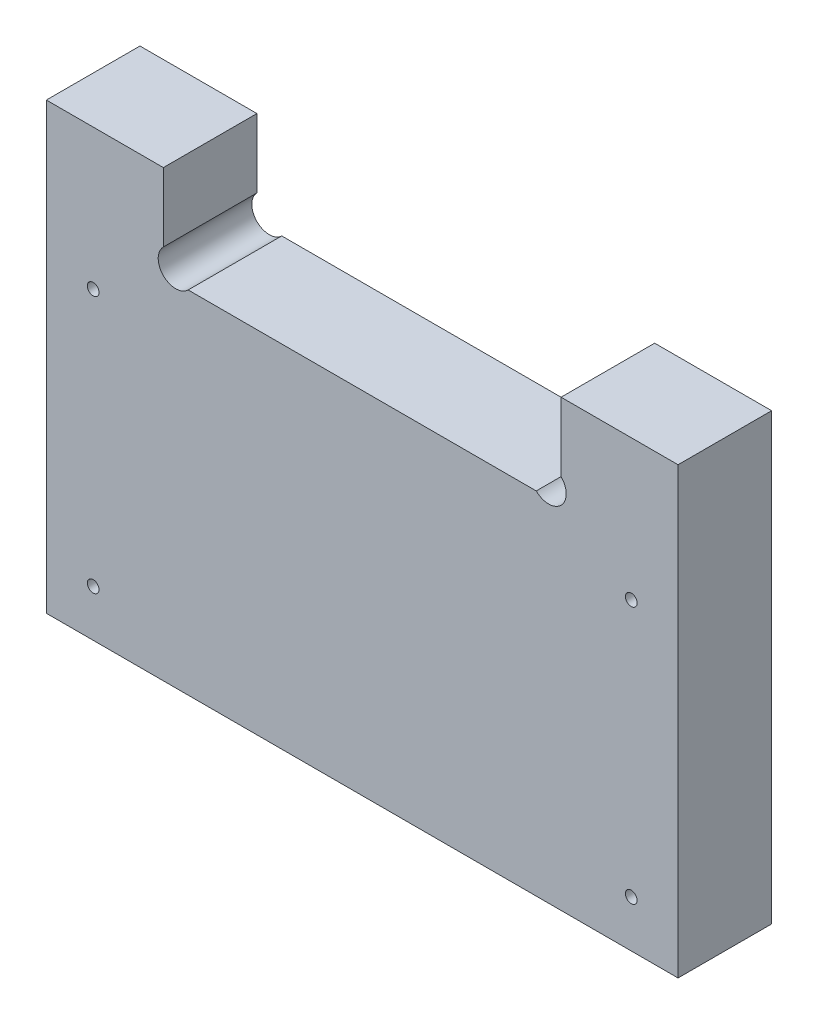
ISO-10303-21;
HEADER;
FILE_DESCRIPTION(('STEP AP214'),'2;1');
FILE_NAME('part.step','',(''),(''),'','','');
FILE_SCHEMA(('AUTOMOTIVE_DESIGN { 1 0 10303 214 1 1 1 1 }'));
ENDSEC;
DATA;
#1=APPLICATION_CONTEXT('core data for automotive mechanical design processes');
#2=APPLICATION_PROTOCOL_DEFINITION('international standard','automotive_design',2000,#1);
#3=PRODUCT_CONTEXT('',#1,'mechanical');
#4=PRODUCT('Part','Part','',(#3));
#5=PRODUCT_RELATED_PRODUCT_CATEGORY('part','',(#4));
#6=PRODUCT_DEFINITION_FORMATION('','',#4);
#7=PRODUCT_DEFINITION_CONTEXT('part definition',#1,'design');
#8=PRODUCT_DEFINITION('design','',#6,#7);
#9=PRODUCT_DEFINITION_SHAPE('','',#8);
#10=(LENGTH_UNIT() NAMED_UNIT(*) SI_UNIT(.MILLI.,.METRE.));
#11=(NAMED_UNIT(*) PLANE_ANGLE_UNIT() SI_UNIT($,.RADIAN.));
#12=(NAMED_UNIT(*) SI_UNIT($,.STERADIAN.) SOLID_ANGLE_UNIT());
#13=UNCERTAINTY_MEASURE_WITH_UNIT(LENGTH_MEASURE(1.E-05),#10,'distance_accuracy_value','');
#14=(GEOMETRIC_REPRESENTATION_CONTEXT(3) GLOBAL_UNCERTAINTY_ASSIGNED_CONTEXT((#13)) GLOBAL_UNIT_ASSIGNED_CONTEXT((#10,
#11,#12)) REPRESENTATION_CONTEXT('',''));
#15=CARTESIAN_POINT('',(0.,0.,0.));
#16=DIRECTION('',(0.,0.,1.));
#17=DIRECTION('',(1.,0.,0.));
#18=AXIS2_PLACEMENT_3D('',#15,#16,#17);
#19=CARTESIAN_POINT('',(-114.826935211401,-44.3478207107489,8.));
#20=DIRECTION('',(0.,1.,0.));
#21=DIRECTION('',(0.,0.,1.));
#22=AXIS2_PLACEMENT_3D('',#19,#20,#21);
#23=PLANE('',#22);
#24=DIRECTION('',(1.,0.,0.));
#25=VECTOR('',#24,1.);
#26=CARTESIAN_POINT('',(-114.826935211401,-44.3478207107489,0.));
#27=LINE('',#26,#25);
#28=CARTESIAN_POINT('',(-114.826935211401,-44.3478207107489,0.));
#29=VERTEX_POINT('',#28);
#30=CARTESIAN_POINT('',(-60.8269352114008,-44.3478207107489,0.));
#31=VERTEX_POINT('',#30);
#32=EDGE_CURVE('E140',#29,#31,#27,.T.);
#33=ORIENTED_EDGE('',*,*,#32,.T.);
#34=DIRECTION('',(0.,0.,-1.));
#35=VECTOR('',#34,1.);
#36=CARTESIAN_POINT('',(-60.8269352114008,-44.3478207107489,8.));
#37=LINE('',#36,#35);
#38=CARTESIAN_POINT('',(-60.8269352114008,-44.3478207107489,8.));
#39=VERTEX_POINT('',#38);
#40=EDGE_CURVE('E11',#39,#31,#37,.T.);
#41=ORIENTED_EDGE('',*,*,#40,.F.);
#42=DIRECTION('',(1.,0.,0.));
#43=VECTOR('',#42,1.);
#44=CARTESIAN_POINT('',(-114.826935211401,-44.3478207107489,8.));
#45=LINE('',#44,#43);
#46=CARTESIAN_POINT('',(-114.826935211401,-44.3478207107489,8.));
#47=VERTEX_POINT('',#46);
#48=EDGE_CURVE('E159',#47,#39,#45,.T.);
#49=ORIENTED_EDGE('',*,*,#48,.F.);
#50=DIRECTION('',(0.,0.,-1.));
#51=VECTOR('',#50,1.);
#52=CARTESIAN_POINT('',(-114.826935211401,-44.3478207107489,8.));
#53=LINE('',#52,#51);
#54=EDGE_CURVE('E136',#47,#29,#53,.T.);
#55=ORIENTED_EDGE('',*,*,#54,.T.);
#56=EDGE_LOOP('',(#33,#41,#49,#55));
#57=FACE_BOUND('',#56,.T.);
#58=ADVANCED_FACE('F32',(#57),#23,.F.);
#59=CARTESIAN_POINT('',(-60.8269352114008,-6.34782071074889,8.));
#60=DIRECTION('',(-1.,0.,0.));
#61=DIRECTION('',(0.,-1.,0.));
#62=AXIS2_PLACEMENT_3D('',#59,#60,#61);
#63=PLANE('',#62);
#64=DIRECTION('',(0.,1.,0.));
#65=VECTOR('',#64,1.);
#66=CARTESIAN_POINT('',(-60.8269352114008,-6.34782071074889,0.));
#67=LINE('',#66,#65);
#68=CARTESIAN_POINT('',(-60.8269352114008,-6.34782071074889,0.));
#69=VERTEX_POINT('',#68);
#70=EDGE_CURVE('E143',#31,#69,#67,.T.);
#71=ORIENTED_EDGE('',*,*,#70,.T.);
#72=DIRECTION('',(0.,0.,-1.));
#73=VECTOR('',#72,1.);
#74=CARTESIAN_POINT('',(-60.8269352114008,-6.34782071074889,8.));
#75=LINE('',#74,#73);
#76=CARTESIAN_POINT('',(-60.8269352114008,-6.34782071074889,8.));
#77=VERTEX_POINT('',#76);
#78=EDGE_CURVE('E40',#77,#69,#75,.T.);
#79=ORIENTED_EDGE('',*,*,#78,.F.);
#80=DIRECTION('',(0.,1.,0.));
#81=VECTOR('',#80,1.);
#82=CARTESIAN_POINT('',(-60.8269352114008,-6.34782071074889,8.));
#83=LINE('',#82,#81);
#84=EDGE_CURVE('E97',#39,#77,#83,.T.);
#85=ORIENTED_EDGE('',*,*,#84,.F.);
#86=ORIENTED_EDGE('',*,*,#40,.T.);
#87=EDGE_LOOP('',(#71,#79,#85,#86));
#88=FACE_BOUND('',#87,.T.);
#89=ADVANCED_FACE('F263',(#88),#63,.F.);
#90=CARTESIAN_POINT('',(-60.8269352114008,-6.34782071074889,8.));
#91=DIRECTION('',(0.,-1.,0.));
#92=DIRECTION('',(1.,0.,0.));
#93=AXIS2_PLACEMENT_3D('',#90,#91,#92);
#94=PLANE('',#93);
#95=DIRECTION('',(-1.,0.,0.));
#96=VECTOR('',#95,1.);
#97=CARTESIAN_POINT('',(-60.8269352114008,-6.34782071074889,0.));
#98=LINE('',#97,#96);
#99=CARTESIAN_POINT('',(-70.8269352114008,-6.34782071074889,0.));
#100=VERTEX_POINT('',#99);
#101=EDGE_CURVE('E146',#69,#100,#98,.T.);
#102=ORIENTED_EDGE('',*,*,#101,.T.);
#103=DIRECTION('',(0.,0.,-1.));
#104=VECTOR('',#103,1.);
#105=CARTESIAN_POINT('',(-70.8269352114008,-6.34782071074889,8.));
#106=LINE('',#105,#104);
#107=CARTESIAN_POINT('',(-70.8269352114008,-6.34782071074889,8.));
#108=VERTEX_POINT('',#107);
#109=EDGE_CURVE('E172',#108,#100,#106,.T.);
#110=ORIENTED_EDGE('',*,*,#109,.F.);
#111=DIRECTION('',(-1.,0.,0.));
#112=VECTOR('',#111,1.);
#113=CARTESIAN_POINT('',(-60.8269352114008,-6.34782071074889,8.));
#114=LINE('',#113,#112);
#115=EDGE_CURVE('E180',#77,#108,#114,.T.);
#116=ORIENTED_EDGE('',*,*,#115,.F.);
#117=ORIENTED_EDGE('',*,*,#78,.T.);
#118=EDGE_LOOP('',(#102,#110,#116,#117));
#119=FACE_BOUND('',#118,.T.);
#120=ADVANCED_FACE('F178',(#119),#94,.F.);
#121=CARTESIAN_POINT('',(-70.8269352114008,-6.34782071074889,8.));
#122=DIRECTION('',(1.,0.,0.));
#123=DIRECTION('',(0.,0.,-1.));
#124=AXIS2_PLACEMENT_3D('',#121,#122,#123);
#125=PLANE('',#124);
#126=DIRECTION('',(0.,-1.,0.));
#127=VECTOR('',#126,1.);
#128=CARTESIAN_POINT('',(-70.8269352114008,-6.34782071074889,0.));
#129=LINE('',#128,#127);
#130=CARTESIAN_POINT('',(-70.8269352114008,-12.2265003671892,0.));
#131=VERTEX_POINT('',#130);
#132=EDGE_CURVE('E148',#100,#131,#129,.T.);
#133=ORIENTED_EDGE('',*,*,#132,.T.);
#134=DIRECTION('',(0.,0.,-1.));
#135=VECTOR('',#134,1.);
#136=CARTESIAN_POINT('',(-70.8269352114008,-12.2265003671892,8.));
#137=LINE('',#136,#135);
#138=CARTESIAN_POINT('',(-70.8269352114008,-12.2265003671892,8.));
#139=VERTEX_POINT('',#138);
#140=EDGE_CURVE('E169',#139,#131,#137,.T.);
#141=ORIENTED_EDGE('',*,*,#140,.F.);
#142=DIRECTION('',(0.,-1.,0.));
#143=VECTOR('',#142,1.);
#144=CARTESIAN_POINT('',(-70.8269352114008,-6.34782071074889,8.));
#145=LINE('',#144,#143);
#146=EDGE_CURVE('E198',#108,#139,#145,.T.);
#147=ORIENTED_EDGE('',*,*,#146,.F.);
#148=ORIENTED_EDGE('',*,*,#109,.T.);
#149=EDGE_LOOP('',(#133,#141,#147,#148));
#150=FACE_BOUND('',#149,.T.);
#151=ADVANCED_FACE('F189',(#150),#125,.F.);
#152=CARTESIAN_POINT('',(-71.8875953831806,-13.2871605389691,8.));
#153=DIRECTION('',(0.,0.,-1.));
#154=DIRECTION('',(-1.,0.,0.));
#155=AXIS2_PLACEMENT_3D('',#152,#153,#154);
#156=CYLINDRICAL_SURFACE('',#155,1.5);
#157=CARTESIAN_POINT('',(-71.8875953831806,-13.2871605389691,0.));
#158=DIRECTION('',(0.,0.,-1.));
#159=DIRECTION('',(1.,0.,0.));
#160=AXIS2_PLACEMENT_3D('',#157,#158,#159);
#161=CIRCLE('',#160,1.5);
#162=CARTESIAN_POINT('',(-72.9482555549604,-14.3478207107489,0.));
#163=VERTEX_POINT('',#162);
#164=EDGE_CURVE('E150',#131,#163,#161,.T.);
#165=ORIENTED_EDGE('',*,*,#164,.T.);
#166=DIRECTION('',(0.,0.,-1.));
#167=VECTOR('',#166,1.);
#168=CARTESIAN_POINT('',(-72.9482555549604,-14.3478207107489,8.));
#169=LINE('',#168,#167);
#170=CARTESIAN_POINT('',(-72.9482555549604,-14.3478207107489,8.));
#171=VERTEX_POINT('',#170);
#172=EDGE_CURVE('E166',#171,#163,#169,.T.);
#173=ORIENTED_EDGE('',*,*,#172,.F.);
#174=CARTESIAN_POINT('',(-71.8875953831806,-13.2871605389691,8.));
#175=DIRECTION('',(0.,0.,-1.));
#176=DIRECTION('',(1.,0.,0.));
#177=AXIS2_PLACEMENT_3D('',#174,#175,#176);
#178=CIRCLE('',#177,1.5);
#179=EDGE_CURVE('E195',#139,#171,#178,.T.);
#180=ORIENTED_EDGE('',*,*,#179,.F.);
#181=ORIENTED_EDGE('',*,*,#140,.T.);
#182=EDGE_LOOP('',(#165,#173,#180,#181));
#183=FACE_BOUND('',#182,.T.);
#184=ADVANCED_FACE('F193',(#183),#156,.F.);
#185=CARTESIAN_POINT('',(-102.705614867841,-14.3478207107489,8.));
#186=DIRECTION('',(0.,-1.,0.));
#187=DIRECTION('',(0.,0.,-1.));
#188=AXIS2_PLACEMENT_3D('',#185,#186,#187);
#189=PLANE('',#188);
#190=DIRECTION('',(-1.,0.,0.));
#191=VECTOR('',#190,1.);
#192=CARTESIAN_POINT('',(-102.705614867841,-14.3478207107489,0.));
#193=LINE('',#192,#191);
#194=CARTESIAN_POINT('',(-102.705614867841,-14.3478207107489,0.));
#195=VERTEX_POINT('',#194);
#196=EDGE_CURVE('E152',#163,#195,#193,.T.);
#197=ORIENTED_EDGE('',*,*,#196,.T.);
#198=DIRECTION('',(0.,0.,-1.));
#199=VECTOR('',#198,1.);
#200=CARTESIAN_POINT('',(-102.705614867841,-14.3478207107489,8.));
#201=LINE('',#200,#199);
#202=CARTESIAN_POINT('',(-102.705614867841,-14.3478207107489,8.));
#203=VERTEX_POINT('',#202);
#204=EDGE_CURVE('E163',#203,#195,#201,.T.);
#205=ORIENTED_EDGE('',*,*,#204,.F.);
#206=DIRECTION('',(-1.,0.,0.));
#207=VECTOR('',#206,1.);
#208=CARTESIAN_POINT('',(-102.705614867841,-14.3478207107489,8.));
#209=LINE('',#208,#207);
#210=EDGE_CURVE('E197',#171,#203,#209,.T.);
#211=ORIENTED_EDGE('',*,*,#210,.F.);
#212=ORIENTED_EDGE('',*,*,#172,.T.);
#213=EDGE_LOOP('',(#197,#205,#211,#212));
#214=FACE_BOUND('',#213,.T.);
#215=ADVANCED_FACE('F275',(#214),#189,.F.);
#216=CARTESIAN_POINT('',(-103.766275039621,-13.2871605389691,8.));
#217=DIRECTION('',(0.,0.,-1.));
#218=DIRECTION('',(-1.,0.,0.));
#219=AXIS2_PLACEMENT_3D('',#216,#217,#218);
#220=CYLINDRICAL_SURFACE('',#219,1.5);
#221=CARTESIAN_POINT('',(-103.766275039621,-13.2871605389691,0.));
#222=DIRECTION('',(0.,0.,-1.));
#223=DIRECTION('',(1.,0.,0.));
#224=AXIS2_PLACEMENT_3D('',#221,#222,#223);
#225=CIRCLE('',#224,1.5);
#226=CARTESIAN_POINT('',(-104.826935211401,-12.2265003671892,0.));
#227=VERTEX_POINT('',#226);
#228=EDGE_CURVE('E154',#195,#227,#225,.T.);
#229=ORIENTED_EDGE('',*,*,#228,.T.);
#230=DIRECTION('',(0.,0.,-1.));
#231=VECTOR('',#230,1.);
#232=CARTESIAN_POINT('',(-104.826935211401,-12.2265003671892,8.));
#233=LINE('',#232,#231);
#234=CARTESIAN_POINT('',(-104.826935211401,-12.2265003671892,8.));
#235=VERTEX_POINT('',#234);
#236=EDGE_CURVE('E131',#235,#227,#233,.T.);
#237=ORIENTED_EDGE('',*,*,#236,.F.);
#238=CARTESIAN_POINT('',(-103.766275039621,-13.2871605389691,8.));
#239=DIRECTION('',(0.,0.,-1.));
#240=DIRECTION('',(1.,0.,0.));
#241=AXIS2_PLACEMENT_3D('',#238,#239,#240);
#242=CIRCLE('',#241,1.5);
#243=EDGE_CURVE('E122',#203,#235,#242,.T.);
#244=ORIENTED_EDGE('',*,*,#243,.F.);
#245=ORIENTED_EDGE('',*,*,#204,.T.);
#246=EDGE_LOOP('',(#229,#237,#244,#245));
#247=FACE_BOUND('',#246,.T.);
#248=ADVANCED_FACE('F272',(#247),#220,.F.);
#249=CARTESIAN_POINT('',(-104.826935211401,-6.34782071074889,8.));
#250=DIRECTION('',(-1.,0.,0.));
#251=DIRECTION('',(0.,0.,1.));
#252=AXIS2_PLACEMENT_3D('',#249,#250,#251);
#253=PLANE('',#252);
#254=DIRECTION('',(0.,1.,0.));
#255=VECTOR('',#254,1.);
#256=CARTESIAN_POINT('',(-104.826935211401,-6.34782071074889,0.));
#257=LINE('',#256,#255);
#258=CARTESIAN_POINT('',(-104.826935211401,-6.34782071074889,0.));
#259=VERTEX_POINT('',#258);
#260=EDGE_CURVE('E130',#227,#259,#257,.T.);
#261=ORIENTED_EDGE('',*,*,#260,.T.);
#262=DIRECTION('',(0.,0.,-1.));
#263=VECTOR('',#262,1.);
#264=CARTESIAN_POINT('',(-104.826935211401,-6.34782071074889,8.));
#265=LINE('',#264,#263);
#266=CARTESIAN_POINT('',(-104.826935211401,-6.34782071074889,8.));
#267=VERTEX_POINT('',#266);
#268=EDGE_CURVE('E127',#267,#259,#265,.T.);
#269=ORIENTED_EDGE('',*,*,#268,.F.);
#270=DIRECTION('',(0.,1.,0.));
#271=VECTOR('',#270,1.);
#272=CARTESIAN_POINT('',(-104.826935211401,-6.34782071074889,8.));
#273=LINE('',#272,#271);
#274=EDGE_CURVE('E116',#235,#267,#273,.T.);
#275=ORIENTED_EDGE('',*,*,#274,.F.);
#276=ORIENTED_EDGE('',*,*,#236,.T.);
#277=EDGE_LOOP('',(#261,#269,#275,#276));
#278=FACE_BOUND('',#277,.T.);
#279=ADVANCED_FACE('F128',(#278),#253,.F.);
#280=CARTESIAN_POINT('',(-114.826935211401,-6.34782071074889,8.));
#281=DIRECTION('',(0.,-1.,0.));
#282=DIRECTION('',(0.,0.,-1.));
#283=AXIS2_PLACEMENT_3D('',#280,#281,#282);
#284=PLANE('',#283);
#285=DIRECTION('',(-1.,0.,0.));
#286=VECTOR('',#285,1.);
#287=CARTESIAN_POINT('',(-114.826935211401,-6.34782071074889,0.));
#288=LINE('',#287,#286);
#289=CARTESIAN_POINT('',(-114.826935211401,-6.34782071074889,0.));
#290=VERTEX_POINT('',#289);
#291=EDGE_CURVE('E83',#259,#290,#288,.T.);
#292=ORIENTED_EDGE('',*,*,#291,.T.);
#293=DIRECTION('',(0.,0.,-1.));
#294=VECTOR('',#293,1.);
#295=CARTESIAN_POINT('',(-114.826935211401,-6.34782071074889,8.));
#296=LINE('',#295,#294);
#297=CARTESIAN_POINT('',(-114.826935211401,-6.34782071074889,8.));
#298=VERTEX_POINT('',#297);
#299=EDGE_CURVE('E132',#298,#290,#296,.T.);
#300=ORIENTED_EDGE('',*,*,#299,.F.);
#301=DIRECTION('',(-1.,0.,0.));
#302=VECTOR('',#301,1.);
#303=CARTESIAN_POINT('',(-114.826935211401,-6.34782071074889,8.));
#304=LINE('',#303,#302);
#305=EDGE_CURVE('E120',#267,#298,#304,.T.);
#306=ORIENTED_EDGE('',*,*,#305,.F.);
#307=ORIENTED_EDGE('',*,*,#268,.T.);
#308=EDGE_LOOP('',(#292,#300,#306,#307));
#309=FACE_BOUND('',#308,.T.);
#310=ADVANCED_FACE('F134',(#309),#284,.F.);
#311=CARTESIAN_POINT('',(-114.826935211401,-6.34782071074889,8.));
#312=DIRECTION('',(1.,0.,0.));
#313=DIRECTION('',(0.,1.,0.));
#314=AXIS2_PLACEMENT_3D('',#311,#312,#313);
#315=PLANE('',#314);
#316=DIRECTION('',(0.,-1.,0.));
#317=VECTOR('',#316,1.);
#318=CARTESIAN_POINT('',(-114.826935211401,-6.34782071074889,0.));
#319=LINE('',#318,#317);
#320=EDGE_CURVE('E89',#290,#29,#319,.T.);
#321=ORIENTED_EDGE('',*,*,#320,.T.);
#322=ORIENTED_EDGE('',*,*,#54,.F.);
#323=DIRECTION('',(0.,-1.,0.));
#324=VECTOR('',#323,1.);
#325=CARTESIAN_POINT('',(-114.826935211401,-6.34782071074889,8.));
#326=LINE('',#325,#324);
#327=EDGE_CURVE('E48',#298,#47,#326,.T.);
#328=ORIENTED_EDGE('',*,*,#327,.F.);
#329=ORIENTED_EDGE('',*,*,#299,.T.);
#330=EDGE_LOOP('',(#321,#322,#328,#329));
#331=FACE_BOUND('',#330,.T.);
#332=ADVANCED_FACE('F241',(#331),#315,.F.);
#333=CARTESIAN_POINT('',(-71.8875953831806,-13.2871605389691,8.));
#334=DIRECTION('',(0.,0.,1.));
#335=DIRECTION('',(1.,0.,0.));
#336=AXIS2_PLACEMENT_3D('',#333,#334,#335);
#337=PLANE('',#336);
#338=CARTESIAN_POINT('',(-110.826935211401,-40.3478207107489,8.));
#339=DIRECTION('',(0.,0.,1.));
#340=DIRECTION('',(1.,0.,0.));
#341=AXIS2_PLACEMENT_3D('',#338,#339,#340);
#342=CIRCLE('',#341,0.499999999999999);
#343=CARTESIAN_POINT('',(-110.326935211401,-40.3478207107489,8.));
#344=VERTEX_POINT('',#343);
#345=EDGE_CURVE('E224',#344,#344,#342,.T.);
#346=ORIENTED_EDGE('',*,*,#345,.F.);
#347=EDGE_LOOP('',(#346));
#348=FACE_BOUND('',#347,.T.);
#349=CARTESIAN_POINT('',(-64.8269352114008,-40.3478207107489,8.));
#350=DIRECTION('',(0.,0.,1.));
#351=DIRECTION('',(1.,0.,0.));
#352=AXIS2_PLACEMENT_3D('',#349,#350,#351);
#353=CIRCLE('',#352,0.499999999999999);
#354=CARTESIAN_POINT('',(-64.3269352114008,-40.3478207107489,8.));
#355=VERTEX_POINT('',#354);
#356=EDGE_CURVE('E218',#355,#355,#353,.T.);
#357=ORIENTED_EDGE('',*,*,#356,.F.);
#358=EDGE_LOOP('',(#357));
#359=FACE_BOUND('',#358,.T.);
#360=CARTESIAN_POINT('',(-64.8269352114008,-18.3478207107489,8.));
#361=DIRECTION('',(0.,0.,1.));
#362=DIRECTION('',(1.,0.,0.));
#363=AXIS2_PLACEMENT_3D('',#360,#361,#362);
#364=CIRCLE('',#363,0.499999999999999);
#365=CARTESIAN_POINT('',(-64.3269352114008,-18.3478207107489,8.));
#366=VERTEX_POINT('',#365);
#367=EDGE_CURVE('E212',#366,#366,#364,.T.);
#368=ORIENTED_EDGE('',*,*,#367,.F.);
#369=EDGE_LOOP('',(#368));
#370=FACE_BOUND('',#369,.T.);
#371=CARTESIAN_POINT('',(-110.826935211401,-18.3478207107489,8.));
#372=DIRECTION('',(0.,0.,1.));
#373=DIRECTION('',(1.,0.,0.));
#374=AXIS2_PLACEMENT_3D('',#371,#372,#373);
#375=CIRCLE('',#374,0.499999999999999);
#376=CARTESIAN_POINT('',(-110.326935211401,-18.3478207107489,8.));
#377=VERTEX_POINT('',#376);
#378=EDGE_CURVE('E206',#377,#377,#375,.T.);
#379=ORIENTED_EDGE('',*,*,#378,.F.);
#380=EDGE_LOOP('',(#379));
#381=FACE_BOUND('',#380,.T.);
#382=ORIENTED_EDGE('',*,*,#48,.T.);
#383=ORIENTED_EDGE('',*,*,#84,.T.);
#384=ORIENTED_EDGE('',*,*,#115,.T.);
#385=ORIENTED_EDGE('',*,*,#146,.T.);
#386=ORIENTED_EDGE('',*,*,#179,.T.);
#387=ORIENTED_EDGE('',*,*,#210,.T.);
#388=ORIENTED_EDGE('',*,*,#243,.T.);
#389=ORIENTED_EDGE('',*,*,#274,.T.);
#390=ORIENTED_EDGE('',*,*,#305,.T.);
#391=ORIENTED_EDGE('',*,*,#327,.T.);
#392=EDGE_LOOP('',(#382,#383,#384,#385,#386,#387,#388,#389,#390,#391));
#393=FACE_BOUND('',#392,.T.);
#394=ADVANCED_FACE('F118',(#348,#359,#370,#381,#393),#337,.T.);
#395=CARTESIAN_POINT('',(-71.8875953831806,-13.2871605389691,0.));
#396=DIRECTION('',(0.,0.,1.));
#397=DIRECTION('',(1.,0.,0.));
#398=AXIS2_PLACEMENT_3D('',#395,#396,#397);
#399=PLANE('',#398);
#400=CARTESIAN_POINT('',(-110.826935211401,-40.3478207107489,0.));
#401=DIRECTION('',(0.,0.,1.));
#402=DIRECTION('',(1.,0.,0.));
#403=AXIS2_PLACEMENT_3D('',#400,#401,#402);
#404=CIRCLE('',#403,0.499999999999999);
#405=CARTESIAN_POINT('',(-110.326935211401,-40.3478207107489,0.));
#406=VERTEX_POINT('',#405);
#407=EDGE_CURVE('E221',#406,#406,#404,.T.);
#408=ORIENTED_EDGE('',*,*,#407,.T.);
#409=EDGE_LOOP('',(#408));
#410=FACE_BOUND('',#409,.T.);
#411=CARTESIAN_POINT('',(-64.8269352114008,-40.3478207107489,0.));
#412=DIRECTION('',(0.,0.,1.));
#413=DIRECTION('',(1.,0.,0.));
#414=AXIS2_PLACEMENT_3D('',#411,#412,#413);
#415=CIRCLE('',#414,0.499999999999999);
#416=CARTESIAN_POINT('',(-64.3269352114008,-40.3478207107489,0.));
#417=VERTEX_POINT('',#416);
#418=EDGE_CURVE('E215',#417,#417,#415,.T.);
#419=ORIENTED_EDGE('',*,*,#418,.T.);
#420=EDGE_LOOP('',(#419));
#421=FACE_BOUND('',#420,.T.);
#422=CARTESIAN_POINT('',(-64.8269352114008,-18.3478207107489,0.));
#423=DIRECTION('',(0.,0.,1.));
#424=DIRECTION('',(1.,0.,0.));
#425=AXIS2_PLACEMENT_3D('',#422,#423,#424);
#426=CIRCLE('',#425,0.499999999999999);
#427=CARTESIAN_POINT('',(-64.3269352114008,-18.3478207107489,0.));
#428=VERTEX_POINT('',#427);
#429=EDGE_CURVE('E209',#428,#428,#426,.T.);
#430=ORIENTED_EDGE('',*,*,#429,.T.);
#431=EDGE_LOOP('',(#430));
#432=FACE_BOUND('',#431,.T.);
#433=CARTESIAN_POINT('',(-110.826935211401,-18.3478207107489,0.));
#434=DIRECTION('',(0.,0.,1.));
#435=DIRECTION('',(1.,0.,0.));
#436=AXIS2_PLACEMENT_3D('',#433,#434,#435);
#437=CIRCLE('',#436,0.499999999999999);
#438=CARTESIAN_POINT('',(-110.326935211401,-18.3478207107489,0.));
#439=VERTEX_POINT('',#438);
#440=EDGE_CURVE('E144',#439,#439,#437,.T.);
#441=ORIENTED_EDGE('',*,*,#440,.T.);
#442=EDGE_LOOP('',(#441));
#443=FACE_BOUND('',#442,.T.);
#444=ORIENTED_EDGE('',*,*,#32,.F.);
#445=ORIENTED_EDGE('',*,*,#320,.F.);
#446=ORIENTED_EDGE('',*,*,#291,.F.);
#447=ORIENTED_EDGE('',*,*,#260,.F.);
#448=ORIENTED_EDGE('',*,*,#228,.F.);
#449=ORIENTED_EDGE('',*,*,#196,.F.);
#450=ORIENTED_EDGE('',*,*,#164,.F.);
#451=ORIENTED_EDGE('',*,*,#132,.F.);
#452=ORIENTED_EDGE('',*,*,#101,.F.);
#453=ORIENTED_EDGE('',*,*,#70,.F.);
#454=EDGE_LOOP('',(#444,#445,#446,#447,#448,#449,#450,#451,#452,#453));
#455=FACE_BOUND('',#454,.T.);
#456=ADVANCED_FACE('F184',(#410,#421,#432,#443,#455),#399,.F.);
#457=CARTESIAN_POINT('',(-110.826935211401,-18.3478207107489,0.));
#458=DIRECTION('',(0.,0.,1.));
#459=DIRECTION('',(1.,0.,0.));
#460=AXIS2_PLACEMENT_3D('',#457,#458,#459);
#461=CYLINDRICAL_SURFACE('',#460,0.499999999999999);
#462=ORIENTED_EDGE('',*,*,#440,.F.);
#463=EDGE_LOOP('',(#462));
#464=FACE_BOUND('',#463,.T.);
#465=ORIENTED_EDGE('',*,*,#378,.T.);
#466=EDGE_LOOP('',(#465));
#467=FACE_BOUND('',#466,.T.);
#468=ADVANCED_FACE('F249',(#464,#467),#461,.F.);
#469=CARTESIAN_POINT('',(-64.8269352114008,-18.3478207107489,0.));
#470=DIRECTION('',(0.,0.,1.));
#471=DIRECTION('',(1.,0.,0.));
#472=AXIS2_PLACEMENT_3D('',#469,#470,#471);
#473=CYLINDRICAL_SURFACE('',#472,0.499999999999999);
#474=ORIENTED_EDGE('',*,*,#429,.F.);
#475=EDGE_LOOP('',(#474));
#476=FACE_BOUND('',#475,.T.);
#477=ORIENTED_EDGE('',*,*,#367,.T.);
#478=EDGE_LOOP('',(#477));
#479=FACE_BOUND('',#478,.T.);
#480=ADVANCED_FACE('F251',(#476,#479),#473,.F.);
#481=CARTESIAN_POINT('',(-64.8269352114008,-40.3478207107489,0.));
#482=DIRECTION('',(0.,0.,1.));
#483=DIRECTION('',(1.,0.,0.));
#484=AXIS2_PLACEMENT_3D('',#481,#482,#483);
#485=CYLINDRICAL_SURFACE('',#484,0.499999999999999);
#486=ORIENTED_EDGE('',*,*,#418,.F.);
#487=EDGE_LOOP('',(#486));
#488=FACE_BOUND('',#487,.T.);
#489=ORIENTED_EDGE('',*,*,#356,.T.);
#490=EDGE_LOOP('',(#489));
#491=FACE_BOUND('',#490,.T.);
#492=ADVANCED_FACE('F235',(#488,#491),#485,.F.);
#493=CARTESIAN_POINT('',(-110.826935211401,-40.3478207107489,0.));
#494=DIRECTION('',(0.,0.,1.));
#495=DIRECTION('',(1.,0.,0.));
#496=AXIS2_PLACEMENT_3D('',#493,#494,#495);
#497=CYLINDRICAL_SURFACE('',#496,0.499999999999999);
#498=ORIENTED_EDGE('',*,*,#407,.F.);
#499=EDGE_LOOP('',(#498));
#500=FACE_BOUND('',#499,.T.);
#501=ORIENTED_EDGE('',*,*,#345,.T.);
#502=EDGE_LOOP('',(#501));
#503=FACE_BOUND('',#502,.T.);
#504=ADVANCED_FACE('F232',(#500,#503),#497,.F.);
#505=CLOSED_SHELL('',(#58,#89,#120,#151,#184,#215,#248,#279,#310,#332,#394,#456,#468,#480,#492,#504));
#506=MANIFOLD_SOLID_BREP('B2',#505);
#507=ADVANCED_BREP_SHAPE_REPRESENTATION('',(#18,#506),#14);
#508=SHAPE_DEFINITION_REPRESENTATION(#9,#507);
ENDSEC;
END-ISO-10303-21;
